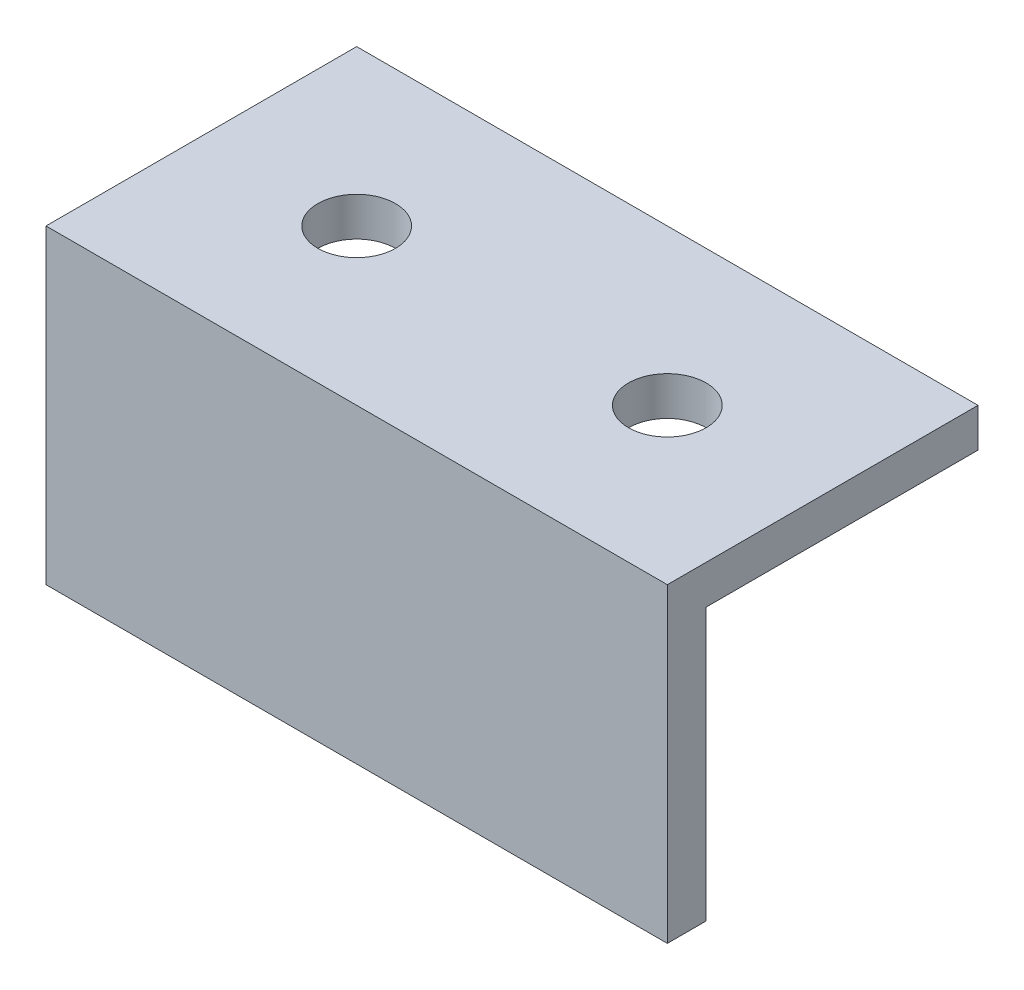
ISO-10303-21;
HEADER;
FILE_DESCRIPTION(('STEP AP214'),'2;1');
FILE_NAME('part.step','',(''),(''),'','','');
FILE_SCHEMA(('AUTOMOTIVE_DESIGN { 1 0 10303 214 1 1 1 1 }'));
ENDSEC;
DATA;
#1=APPLICATION_CONTEXT('core data for automotive mechanical design processes');
#2=APPLICATION_PROTOCOL_DEFINITION('international standard','automotive_design',2000,#1);
#3=PRODUCT_CONTEXT('',#1,'mechanical');
#4=PRODUCT('Part','Part','',(#3));
#5=PRODUCT_RELATED_PRODUCT_CATEGORY('part','',(#4));
#6=PRODUCT_DEFINITION_FORMATION('','',#4);
#7=PRODUCT_DEFINITION_CONTEXT('part definition',#1,'design');
#8=PRODUCT_DEFINITION('design','',#6,#7);
#9=PRODUCT_DEFINITION_SHAPE('','',#8);
#10=(LENGTH_UNIT() NAMED_UNIT(*) SI_UNIT(.MILLI.,.METRE.));
#11=(NAMED_UNIT(*) PLANE_ANGLE_UNIT() SI_UNIT($,.RADIAN.));
#12=(NAMED_UNIT(*) SI_UNIT($,.STERADIAN.) SOLID_ANGLE_UNIT());
#13=UNCERTAINTY_MEASURE_WITH_UNIT(LENGTH_MEASURE(1.E-05),#10,'distance_accuracy_value','');
#14=(GEOMETRIC_REPRESENTATION_CONTEXT(3) GLOBAL_UNCERTAINTY_ASSIGNED_CONTEXT((#13)) GLOBAL_UNIT_ASSIGNED_CONTEXT((#10,
#11,#12)) REPRESENTATION_CONTEXT('',''));
#15=CARTESIAN_POINT('',(0.,0.,0.));
#16=DIRECTION('',(0.,0.,1.));
#17=DIRECTION('',(1.,0.,0.));
#18=AXIS2_PLACEMENT_3D('',#15,#16,#17);
#19=CARTESIAN_POINT('',(25.4,0.,-1.5875));
#20=DIRECTION('',(0.,1.,0.));
#21=DIRECTION('',(0.,0.,1.));
#22=AXIS2_PLACEMENT_3D('',#19,#20,#21);
#23=PLANE('',#22);
#24=DIRECTION('',(0.,0.,-1.));
#25=VECTOR('',#24,1.);
#26=CARTESIAN_POINT('',(0.,0.,-1.5875));
#27=LINE('',#26,#25);
#28=CARTESIAN_POINT('',(0.,0.,0.));
#29=VERTEX_POINT('',#28);
#30=CARTESIAN_POINT('',(0.,0.,-1.5875));
#31=VERTEX_POINT('',#30);
#32=EDGE_CURVE('E117',#29,#31,#27,.T.);
#33=ORIENTED_EDGE('',*,*,#32,.T.);
#34=DIRECTION('',(-1.,0.,0.));
#35=VECTOR('',#34,1.);
#36=CARTESIAN_POINT('',(25.4,0.,-1.5875));
#37=LINE('',#36,#35);
#38=CARTESIAN_POINT('',(25.4,0.,-1.5875));
#39=VERTEX_POINT('',#38);
#40=EDGE_CURVE('E11',#39,#31,#37,.T.);
#41=ORIENTED_EDGE('',*,*,#40,.F.);
#42=DIRECTION('',(0.,0.,-1.));
#43=VECTOR('',#42,1.);
#44=CARTESIAN_POINT('',(25.4,0.,-1.5875));
#45=LINE('',#44,#43);
#46=CARTESIAN_POINT('',(25.4,0.,0.));
#47=VERTEX_POINT('',#46);
#48=EDGE_CURVE('E128',#47,#39,#45,.T.);
#49=ORIENTED_EDGE('',*,*,#48,.F.);
#50=DIRECTION('',(-1.,0.,0.));
#51=VECTOR('',#50,1.);
#52=CARTESIAN_POINT('',(25.4,0.,0.));
#53=LINE('',#52,#51);
#54=EDGE_CURVE('E113',#47,#29,#53,.T.);
#55=ORIENTED_EDGE('',*,*,#54,.T.);
#56=EDGE_LOOP('',(#33,#41,#49,#55));
#57=FACE_BOUND('',#56,.T.);
#58=ADVANCED_FACE('F33',(#57),#23,.F.);
#59=CARTESIAN_POINT('',(25.4,11.1125,-1.5875));
#60=DIRECTION('',(0.,0.,1.));
#61=DIRECTION('',(0.,-1.,0.));
#62=AXIS2_PLACEMENT_3D('',#59,#60,#61);
#63=PLANE('',#62);
#64=DIRECTION('',(0.,1.,0.));
#65=VECTOR('',#64,1.);
#66=CARTESIAN_POINT('',(0.,11.1125,-1.5875));
#67=LINE('',#66,#65);
#68=CARTESIAN_POINT('',(0.,11.1125,-1.5875));
#69=VERTEX_POINT('',#68);
#70=EDGE_CURVE('E120',#31,#69,#67,.T.);
#71=ORIENTED_EDGE('',*,*,#70,.T.);
#72=DIRECTION('',(-1.,0.,0.));
#73=VECTOR('',#72,1.);
#74=CARTESIAN_POINT('',(25.4,11.1125,-1.5875));
#75=LINE('',#74,#73);
#76=CARTESIAN_POINT('',(25.4,11.1125,-1.5875));
#77=VERTEX_POINT('',#76);
#78=EDGE_CURVE('E41',#77,#69,#75,.T.);
#79=ORIENTED_EDGE('',*,*,#78,.F.);
#80=DIRECTION('',(0.,1.,0.));
#81=VECTOR('',#80,1.);
#82=CARTESIAN_POINT('',(25.4,11.1125,-1.5875));
#83=LINE('',#82,#81);
#84=EDGE_CURVE('E86',#39,#77,#83,.T.);
#85=ORIENTED_EDGE('',*,*,#84,.F.);
#86=ORIENTED_EDGE('',*,*,#40,.T.);
#87=EDGE_LOOP('',(#71,#79,#85,#86));
#88=FACE_BOUND('',#87,.T.);
#89=ADVANCED_FACE('F153',(#88),#63,.F.);
#90=CARTESIAN_POINT('',(25.4,11.1125,-12.7));
#91=DIRECTION('',(0.,1.,0.));
#92=DIRECTION('',(0.,0.,1.));
#93=AXIS2_PLACEMENT_3D('',#90,#91,#92);
#94=PLANE('',#93);
#95=CARTESIAN_POINT('',(6.35,11.1125,-6.35));
#96=DIRECTION('',(0.,1.,0.));
#97=DIRECTION('',(0.,0.,1.));
#98=AXIS2_PLACEMENT_3D('',#95,#96,#97);
#99=CIRCLE('',#98,1.5875);
#100=CARTESIAN_POINT('',(6.35,11.1125,-4.7625));
#101=VERTEX_POINT('',#100);
#102=EDGE_CURVE('E218',#101,#101,#99,.F.);
#103=ORIENTED_EDGE('',*,*,#102,.F.);
#104=EDGE_LOOP('',(#103));
#105=FACE_BOUND('',#104,.T.);
#106=CARTESIAN_POINT('',(19.05,11.1125,-6.35));
#107=DIRECTION('',(0.,1.,0.));
#108=DIRECTION('',(0.,0.,1.));
#109=AXIS2_PLACEMENT_3D('',#106,#107,#108);
#110=CIRCLE('',#109,1.5875);
#111=CARTESIAN_POINT('',(19.05,11.1125,-4.7625));
#112=VERTEX_POINT('',#111);
#113=EDGE_CURVE('E121',#112,#112,#110,.F.);
#114=ORIENTED_EDGE('',*,*,#113,.F.);
#115=EDGE_LOOP('',(#114));
#116=FACE_BOUND('',#115,.T.);
#117=DIRECTION('',(0.,0.,-1.));
#118=VECTOR('',#117,1.);
#119=CARTESIAN_POINT('',(0.,11.1125,-12.7));
#120=LINE('',#119,#118);
#121=CARTESIAN_POINT('',(0.,11.1125,-12.7));
#122=VERTEX_POINT('',#121);
#123=EDGE_CURVE('E123',#69,#122,#120,.T.);
#124=ORIENTED_EDGE('',*,*,#123,.T.);
#125=DIRECTION('',(-1.,0.,0.));
#126=VECTOR('',#125,1.);
#127=CARTESIAN_POINT('',(25.4,11.1125,-12.7));
#128=LINE('',#127,#126);
#129=CARTESIAN_POINT('',(25.4,11.1125,-12.7));
#130=VERTEX_POINT('',#129);
#131=EDGE_CURVE('E108',#130,#122,#128,.T.);
#132=ORIENTED_EDGE('',*,*,#131,.F.);
#133=DIRECTION('',(0.,0.,-1.));
#134=VECTOR('',#133,1.);
#135=CARTESIAN_POINT('',(25.4,11.1125,-12.7));
#136=LINE('',#135,#134);
#137=EDGE_CURVE('E99',#77,#130,#136,.T.);
#138=ORIENTED_EDGE('',*,*,#137,.F.);
#139=ORIENTED_EDGE('',*,*,#78,.T.);
#140=EDGE_LOOP('',(#124,#132,#138,#139));
#141=FACE_BOUND('',#140,.T.);
#142=ADVANCED_FACE('F134',(#105,#116,#141),#94,.F.);
#143=CARTESIAN_POINT('',(25.4,12.7,-12.7));
#144=DIRECTION('',(0.,0.,1.));
#145=DIRECTION('',(0.,-1.,0.));
#146=AXIS2_PLACEMENT_3D('',#143,#144,#145);
#147=PLANE('',#146);
#148=DIRECTION('',(0.,1.,0.));
#149=VECTOR('',#148,1.);
#150=CARTESIAN_POINT('',(0.,12.7,-12.7));
#151=LINE('',#150,#149);
#152=CARTESIAN_POINT('',(0.,12.7,-12.7));
#153=VERTEX_POINT('',#152);
#154=EDGE_CURVE('E107',#122,#153,#151,.T.);
#155=ORIENTED_EDGE('',*,*,#154,.T.);
#156=DIRECTION('',(-1.,0.,0.));
#157=VECTOR('',#156,1.);
#158=CARTESIAN_POINT('',(25.4,12.7,-12.7));
#159=LINE('',#158,#157);
#160=CARTESIAN_POINT('',(25.4,12.7,-12.7));
#161=VERTEX_POINT('',#160);
#162=EDGE_CURVE('E104',#161,#153,#159,.T.);
#163=ORIENTED_EDGE('',*,*,#162,.F.);
#164=DIRECTION('',(0.,1.,0.));
#165=VECTOR('',#164,1.);
#166=CARTESIAN_POINT('',(25.4,12.7,-12.7));
#167=LINE('',#166,#165);
#168=EDGE_CURVE('E93',#130,#161,#167,.T.);
#169=ORIENTED_EDGE('',*,*,#168,.F.);
#170=ORIENTED_EDGE('',*,*,#131,.T.);
#171=EDGE_LOOP('',(#155,#163,#169,#170));
#172=FACE_BOUND('',#171,.T.);
#173=ADVANCED_FACE('F105',(#172),#147,.F.);
#174=CARTESIAN_POINT('',(25.4,12.7,0.));
#175=DIRECTION('',(0.,-1.,0.));
#176=DIRECTION('',(0.,0.,-1.));
#177=AXIS2_PLACEMENT_3D('',#174,#175,#176);
#178=PLANE('',#177);
#179=CARTESIAN_POINT('',(6.35,12.7,-6.35));
#180=DIRECTION('',(0.,1.,0.));
#181=DIRECTION('',(0.,0.,1.));
#182=AXIS2_PLACEMENT_3D('',#179,#180,#181);
#183=CIRCLE('',#182,1.5875);
#184=CARTESIAN_POINT('',(6.35,12.7,-4.7625));
#185=VERTEX_POINT('',#184);
#186=EDGE_CURVE('E221',#185,#185,#183,.T.);
#187=ORIENTED_EDGE('',*,*,#186,.F.);
#188=EDGE_LOOP('',(#187));
#189=FACE_BOUND('',#188,.T.);
#190=CARTESIAN_POINT('',(19.05,12.7,-6.35));
#191=DIRECTION('',(0.,1.,0.));
#192=DIRECTION('',(0.,0.,1.));
#193=AXIS2_PLACEMENT_3D('',#190,#191,#192);
#194=CIRCLE('',#193,1.5875);
#195=CARTESIAN_POINT('',(19.05,12.7,-4.7625));
#196=VERTEX_POINT('',#195);
#197=EDGE_CURVE('E223',#196,#196,#194,.T.);
#198=ORIENTED_EDGE('',*,*,#197,.F.);
#199=EDGE_LOOP('',(#198));
#200=FACE_BOUND('',#199,.T.);
#201=DIRECTION('',(0.,0.,1.));
#202=VECTOR('',#201,1.);
#203=CARTESIAN_POINT('',(0.,12.7,0.));
#204=LINE('',#203,#202);
#205=CARTESIAN_POINT('',(0.,12.7,0.));
#206=VERTEX_POINT('',#205);
#207=EDGE_CURVE('E72',#153,#206,#204,.T.);
#208=ORIENTED_EDGE('',*,*,#207,.T.);
#209=DIRECTION('',(-1.,0.,0.));
#210=VECTOR('',#209,1.);
#211=CARTESIAN_POINT('',(25.4,12.7,0.));
#212=LINE('',#211,#210);
#213=CARTESIAN_POINT('',(25.4,12.7,0.));
#214=VERTEX_POINT('',#213);
#215=EDGE_CURVE('E109',#214,#206,#212,.T.);
#216=ORIENTED_EDGE('',*,*,#215,.F.);
#217=DIRECTION('',(0.,0.,1.));
#218=VECTOR('',#217,1.);
#219=CARTESIAN_POINT('',(25.4,12.7,0.));
#220=LINE('',#219,#218);
#221=EDGE_CURVE('E97',#161,#214,#220,.T.);
#222=ORIENTED_EDGE('',*,*,#221,.F.);
#223=ORIENTED_EDGE('',*,*,#162,.T.);
#224=EDGE_LOOP('',(#208,#216,#222,#223));
#225=FACE_BOUND('',#224,.T.);
#226=ADVANCED_FACE('F111',(#189,#200,#225),#178,.F.);
#227=CARTESIAN_POINT('',(25.4,0.,0.));
#228=DIRECTION('',(0.,0.,-1.));
#229=DIRECTION('',(-1.,0.,0.));
#230=AXIS2_PLACEMENT_3D('',#227,#228,#229);
#231=PLANE('',#230);
#232=DIRECTION('',(0.,-1.,0.));
#233=VECTOR('',#232,1.);
#234=CARTESIAN_POINT('',(0.,0.,0.));
#235=LINE('',#234,#233);
#236=EDGE_CURVE('E78',#206,#29,#235,.T.);
#237=ORIENTED_EDGE('',*,*,#236,.T.);
#238=ORIENTED_EDGE('',*,*,#54,.F.);
#239=DIRECTION('',(0.,-1.,0.));
#240=VECTOR('',#239,1.);
#241=CARTESIAN_POINT('',(25.4,0.,0.));
#242=LINE('',#241,#240);
#243=EDGE_CURVE('E49',#214,#47,#242,.T.);
#244=ORIENTED_EDGE('',*,*,#243,.F.);
#245=ORIENTED_EDGE('',*,*,#215,.T.);
#246=EDGE_LOOP('',(#237,#238,#244,#245));
#247=FACE_BOUND('',#246,.T.);
#248=ADVANCED_FACE('F141',(#247),#231,.F.);
#249=CARTESIAN_POINT('',(25.4,0.,0.));
#250=DIRECTION('',(-1.,0.,0.));
#251=DIRECTION('',(0.,0.,1.));
#252=AXIS2_PLACEMENT_3D('',#249,#250,#251);
#253=PLANE('',#252);
#254=ORIENTED_EDGE('',*,*,#48,.T.);
#255=ORIENTED_EDGE('',*,*,#84,.T.);
#256=ORIENTED_EDGE('',*,*,#137,.T.);
#257=ORIENTED_EDGE('',*,*,#168,.T.);
#258=ORIENTED_EDGE('',*,*,#221,.T.);
#259=ORIENTED_EDGE('',*,*,#243,.T.);
#260=EDGE_LOOP('',(#254,#255,#256,#257,#258,#259));
#261=FACE_BOUND('',#260,.T.);
#262=ADVANCED_FACE('F95',(#261),#253,.F.);
#263=CARTESIAN_POINT('',(0.,0.,0.));
#264=DIRECTION('',(-1.,0.,0.));
#265=DIRECTION('',(0.,0.,1.));
#266=AXIS2_PLACEMENT_3D('',#263,#264,#265);
#267=PLANE('',#266);
#268=ORIENTED_EDGE('',*,*,#32,.F.);
#269=ORIENTED_EDGE('',*,*,#236,.F.);
#270=ORIENTED_EDGE('',*,*,#207,.F.);
#271=ORIENTED_EDGE('',*,*,#154,.F.);
#272=ORIENTED_EDGE('',*,*,#123,.F.);
#273=ORIENTED_EDGE('',*,*,#70,.F.);
#274=EDGE_LOOP('',(#268,#269,#270,#271,#272,#273));
#275=FACE_BOUND('',#274,.T.);
#276=ADVANCED_FACE('F137',(#275),#267,.T.);
#277=CARTESIAN_POINT('',(19.05,6.62237193946542,-6.35));
#278=DIRECTION('',(0.,1.,0.));
#279=DIRECTION('',(0.,0.,1.));
#280=AXIS2_PLACEMENT_3D('',#277,#278,#279);
#281=CYLINDRICAL_SURFACE('',#280,1.5875);
#282=ORIENTED_EDGE('',*,*,#113,.T.);
#283=EDGE_LOOP('',(#282));
#284=FACE_BOUND('',#283,.T.);
#285=ORIENTED_EDGE('',*,*,#197,.T.);
#286=EDGE_LOOP('',(#285));
#287=FACE_BOUND('',#286,.T.);
#288=ADVANCED_FACE('F181',(#284,#287),#281,.F.);
#289=CARTESIAN_POINT('',(6.35,6.62237193946542,-6.35));
#290=DIRECTION('',(0.,1.,0.));
#291=DIRECTION('',(0.,0.,1.));
#292=AXIS2_PLACEMENT_3D('',#289,#290,#291);
#293=CYLINDRICAL_SURFACE('',#292,1.5875);
#294=ORIENTED_EDGE('',*,*,#102,.T.);
#295=EDGE_LOOP('',(#294));
#296=FACE_BOUND('',#295,.T.);
#297=ORIENTED_EDGE('',*,*,#186,.T.);
#298=EDGE_LOOP('',(#297));
#299=FACE_BOUND('',#298,.T.);
#300=ADVANCED_FACE('F186',(#296,#299),#293,.F.);
#301=CLOSED_SHELL('',(#58,#89,#142,#173,#226,#248,#262,#276,#288,#300));
#302=MANIFOLD_SOLID_BREP('B2',#301);
#303=ADVANCED_BREP_SHAPE_REPRESENTATION('',(#18,#302),#14);
#304=SHAPE_DEFINITION_REPRESENTATION(#9,#303);
ENDSEC;
END-ISO-10303-21;
